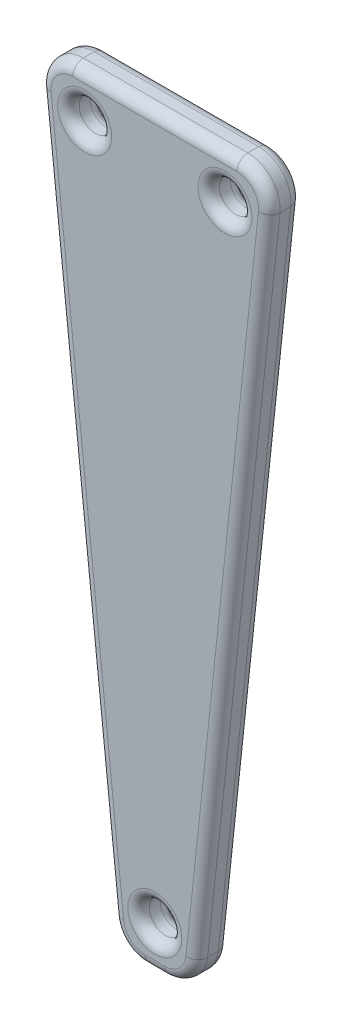
ISO-10303-21;
HEADER;
FILE_DESCRIPTION(('STEP AP214'),'2;1');
FILE_NAME('part.step','',(''),(''),'','','');
FILE_SCHEMA(('AUTOMOTIVE_DESIGN { 1 0 10303 214 1 1 1 1 }'));
ENDSEC;
DATA;
#1=APPLICATION_CONTEXT('core data for automotive mechanical design processes');
#2=APPLICATION_PROTOCOL_DEFINITION('international standard','automotive_design',2000,#1);
#3=PRODUCT_CONTEXT('',#1,'mechanical');
#4=PRODUCT('Part','Part','',(#3));
#5=PRODUCT_RELATED_PRODUCT_CATEGORY('part','',(#4));
#6=PRODUCT_DEFINITION_FORMATION('','',#4);
#7=PRODUCT_DEFINITION_CONTEXT('part definition',#1,'design');
#8=PRODUCT_DEFINITION('design','',#6,#7);
#9=PRODUCT_DEFINITION_SHAPE('','',#8);
#10=(LENGTH_UNIT() NAMED_UNIT(*) SI_UNIT(.MILLI.,.METRE.));
#11=(NAMED_UNIT(*) PLANE_ANGLE_UNIT() SI_UNIT($,.RADIAN.));
#12=(NAMED_UNIT(*) SI_UNIT($,.STERADIAN.) SOLID_ANGLE_UNIT());
#13=UNCERTAINTY_MEASURE_WITH_UNIT(LENGTH_MEASURE(1.E-05),#10,'distance_accuracy_value','');
#14=(GEOMETRIC_REPRESENTATION_CONTEXT(3) GLOBAL_UNCERTAINTY_ASSIGNED_CONTEXT((#13)) GLOBAL_UNIT_ASSIGNED_CONTEXT((#10,
#11,#12)) REPRESENTATION_CONTEXT('',''));
#15=CARTESIAN_POINT('',(0.,0.,0.));
#16=DIRECTION('',(0.,0.,1.));
#17=DIRECTION('',(1.,0.,0.));
#18=AXIS2_PLACEMENT_3D('',#15,#16,#17);
#19=CARTESIAN_POINT('',(5.6007713783845,-62.08,3.));
#20=DIRECTION('',(0.,0.,1.));
#21=DIRECTION('',(1.,0.,0.));
#22=AXIS2_PLACEMENT_3D('',#19,#20,#21);
#23=PLANE('',#22);
#24=DIRECTION('',(0.105820305301029,-0.994385268890281,0.));
#25=VECTOR('',#24,1.);
#26=CARTESIAN_POINT('',(3.61200084060394,-62.291640610602,3.));
#27=LINE('',#26,#25);
#28=CARTESIAN_POINT('',(-3.10083478480537,0.788359389397927,3.));
#29=VERTEX_POINT('',#28);
#30=CARTESIAN_POINT('',(3.61200084060394,-62.291640610602,3.));
#31=VERTEX_POINT('',#30);
#32=EDGE_CURVE('E156',#29,#31,#27,.T.);
#33=ORIENTED_EDGE('',*,*,#32,.T.);
#34=CARTESIAN_POINT('',(5.6007713783845,-62.08,3.));
#35=DIRECTION('',(0.,0.,1.));
#36=DIRECTION('',(1.,0.,0.));
#37=AXIS2_PLACEMENT_3D('',#34,#35,#36);
#38=CIRCLE('',#37,2.);
#39=CARTESIAN_POINT('',(5.60077137838452,-64.08,3.));
#40=VERTEX_POINT('',#39);
#41=EDGE_CURVE('E192',#31,#40,#38,.T.);
#42=ORIENTED_EDGE('',*,*,#41,.T.);
#43=DIRECTION('',(1.,0.,0.));
#44=VECTOR('',#43,1.);
#45=CARTESIAN_POINT('',(7.39922862161549,-64.08,3.));
#46=LINE('',#45,#44);
#47=CARTESIAN_POINT('',(7.39922862161549,-64.08,3.));
#48=VERTEX_POINT('',#47);
#49=EDGE_CURVE('E190',#40,#48,#46,.T.);
#50=ORIENTED_EDGE('',*,*,#49,.T.);
#51=CARTESIAN_POINT('',(7.39922862161551,-62.08,3.));
#52=DIRECTION('',(0.,0.,1.));
#53=DIRECTION('',(1.,0.,0.));
#54=AXIS2_PLACEMENT_3D('',#51,#52,#53);
#55=CIRCLE('',#54,2.);
#56=CARTESIAN_POINT('',(9.38799915939608,-62.291640610602,3.));
#57=VERTEX_POINT('',#56);
#58=EDGE_CURVE('E188',#48,#57,#55,.T.);
#59=ORIENTED_EDGE('',*,*,#58,.T.);
#60=DIRECTION('',(0.105820305301028,0.994385268890281,0.));
#61=VECTOR('',#60,1.);
#62=CARTESIAN_POINT('',(16.1008347848054,0.788359389397919,3.));
#63=LINE('',#62,#61);
#64=CARTESIAN_POINT('',(16.1008347848054,0.788359389397918,3.));
#65=VERTEX_POINT('',#64);
#66=EDGE_CURVE('E186',#57,#65,#63,.T.);
#67=ORIENTED_EDGE('',*,*,#66,.T.);
#68=CARTESIAN_POINT('',(14.1120642470248,1.,3.));
#69=DIRECTION('',(0.,0.,1.));
#70=DIRECTION('',(1.,0.,0.));
#71=AXIS2_PLACEMENT_3D('',#68,#69,#70);
#72=CIRCLE('',#71,2.);
#73=CARTESIAN_POINT('',(14.1120642470248,3.,3.));
#74=VERTEX_POINT('',#73);
#75=EDGE_CURVE('E184',#65,#74,#72,.T.);
#76=ORIENTED_EDGE('',*,*,#75,.T.);
#77=DIRECTION('',(-1.,0.,0.));
#78=VECTOR('',#77,1.);
#79=CARTESIAN_POINT('',(-1.11206424702478,3.,3.));
#80=LINE('',#79,#78);
#81=CARTESIAN_POINT('',(-1.11206424702478,3.,3.));
#82=VERTEX_POINT('',#81);
#83=EDGE_CURVE('E159',#74,#82,#80,.T.);
#84=ORIENTED_EDGE('',*,*,#83,.T.);
#85=CARTESIAN_POINT('',(-1.1120642470248,1.,3.));
#86=DIRECTION('',(0.,0.,1.));
#87=DIRECTION('',(1.,0.,0.));
#88=AXIS2_PLACEMENT_3D('',#85,#86,#87);
#89=CIRCLE('',#88,2.);
#90=EDGE_CURVE('E151',#82,#29,#89,.T.);
#91=ORIENTED_EDGE('',*,*,#90,.T.);
#92=EDGE_LOOP('',(#33,#42,#50,#59,#67,#76,#84,#91));
#93=FACE_BOUND('',#92,.T.);
#94=CARTESIAN_POINT('',(0.,0.,3.));
#95=DIRECTION('',(0.,0.,1.));
#96=DIRECTION('',(1.,0.,0.));
#97=AXIS2_PLACEMENT_3D('',#94,#95,#96);
#98=CIRCLE('',#97,2.5);
#99=CARTESIAN_POINT('',(2.5,0.,3.));
#100=VERTEX_POINT('',#99);
#101=EDGE_CURVE('E176',#100,#100,#98,.F.);
#102=ORIENTED_EDGE('',*,*,#101,.T.);
#103=EDGE_LOOP('',(#102));
#104=FACE_BOUND('',#103,.T.);
#105=CARTESIAN_POINT('',(13.,0.,3.));
#106=DIRECTION('',(0.,0.,1.));
#107=DIRECTION('',(1.,0.,0.));
#108=AXIS2_PLACEMENT_3D('',#105,#106,#107);
#109=CIRCLE('',#108,2.5);
#110=CARTESIAN_POINT('',(15.5,0.,3.));
#111=VERTEX_POINT('',#110);
#112=EDGE_CURVE('E179',#111,#111,#109,.F.);
#113=ORIENTED_EDGE('',*,*,#112,.T.);
#114=EDGE_LOOP('',(#113));
#115=FACE_BOUND('',#114,.T.);
#116=CARTESIAN_POINT('',(6.50000000000001,-61.08,3.));
#117=DIRECTION('',(0.,0.,1.));
#118=DIRECTION('',(1.,0.,0.));
#119=AXIS2_PLACEMENT_3D('',#116,#117,#118);
#120=CIRCLE('',#119,2.5);
#121=CARTESIAN_POINT('',(9.00000000000001,-61.08,3.));
#122=VERTEX_POINT('',#121);
#123=EDGE_CURVE('E354',#122,#122,#120,.F.);
#124=ORIENTED_EDGE('',*,*,#123,.T.);
#125=EDGE_LOOP('',(#124));
#126=FACE_BOUND('',#125,.T.);
#127=ADVANCED_FACE('F35',(#93,#104,#115,#126),#23,.T.);
#128=CARTESIAN_POINT('',(5.6007713783845,-62.08,0.));
#129=DIRECTION('',(0.,0.,1.));
#130=DIRECTION('',(1.,0.,0.));
#131=AXIS2_PLACEMENT_3D('',#128,#129,#130);
#132=PLANE('',#131);
#133=DIRECTION('',(1.,0.,0.));
#134=VECTOR('',#133,1.);
#135=CARTESIAN_POINT('',(5.6007713783845,-64.08,0.));
#136=LINE('',#135,#134);
#137=CARTESIAN_POINT('',(7.39922862161549,-64.08,0.));
#138=VERTEX_POINT('',#137);
#139=CARTESIAN_POINT('',(5.60077137838452,-64.08,0.));
#140=VERTEX_POINT('',#139);
#141=EDGE_CURVE('E221',#138,#140,#136,.F.);
#142=ORIENTED_EDGE('',*,*,#141,.T.);
#143=CARTESIAN_POINT('',(5.6007713783845,-62.08,0.));
#144=DIRECTION('',(0.,0.,1.));
#145=DIRECTION('',(1.,0.,0.));
#146=AXIS2_PLACEMENT_3D('',#143,#144,#145);
#147=CIRCLE('',#146,2.);
#148=CARTESIAN_POINT('',(3.61200084060394,-62.291640610602,0.));
#149=VERTEX_POINT('',#148);
#150=EDGE_CURVE('E223',#140,#149,#147,.F.);
#151=ORIENTED_EDGE('',*,*,#150,.T.);
#152=DIRECTION('',(0.105820305301029,-0.994385268890281,0.));
#153=VECTOR('',#152,1.);
#154=CARTESIAN_POINT('',(3.61200084060394,-62.2916406106021,0.));
#155=LINE('',#154,#153);
#156=CARTESIAN_POINT('',(-3.10083478480537,0.788359389397927,0.));
#157=VERTEX_POINT('',#156);
#158=EDGE_CURVE('E209',#149,#157,#155,.F.);
#159=ORIENTED_EDGE('',*,*,#158,.T.);
#160=CARTESIAN_POINT('',(-1.1120642470248,1.,0.));
#161=DIRECTION('',(0.,0.,1.));
#162=DIRECTION('',(1.,0.,0.));
#163=AXIS2_PLACEMENT_3D('',#160,#161,#162);
#164=CIRCLE('',#163,2.);
#165=CARTESIAN_POINT('',(-1.11206424702478,3.,0.));
#166=VERTEX_POINT('',#165);
#167=EDGE_CURVE('E211',#157,#166,#164,.F.);
#168=ORIENTED_EDGE('',*,*,#167,.T.);
#169=DIRECTION('',(-1.,0.,0.));
#170=VECTOR('',#169,1.);
#171=CARTESIAN_POINT('',(5.6007713783845,3.,0.));
#172=LINE('',#171,#170);
#173=CARTESIAN_POINT('',(14.1120642470248,3.,0.));
#174=VERTEX_POINT('',#173);
#175=EDGE_CURVE('E213',#166,#174,#172,.F.);
#176=ORIENTED_EDGE('',*,*,#175,.T.);
#177=CARTESIAN_POINT('',(14.1120642470248,1.,0.));
#178=DIRECTION('',(0.,0.,1.));
#179=DIRECTION('',(1.,0.,0.));
#180=AXIS2_PLACEMENT_3D('',#177,#178,#179);
#181=CIRCLE('',#180,2.);
#182=CARTESIAN_POINT('',(16.1008347848054,0.788359389397918,0.));
#183=VERTEX_POINT('',#182);
#184=EDGE_CURVE('E215',#174,#183,#181,.F.);
#185=ORIENTED_EDGE('',*,*,#184,.T.);
#186=DIRECTION('',(0.105820305301028,0.994385268890281,0.));
#187=VECTOR('',#186,1.);
#188=CARTESIAN_POINT('',(9.367860148464,-62.4808853471761,0.));
#189=LINE('',#188,#187);
#190=CARTESIAN_POINT('',(9.38799915939608,-62.291640610602,0.));
#191=VERTEX_POINT('',#190);
#192=EDGE_CURVE('E217',#183,#191,#189,.F.);
#193=ORIENTED_EDGE('',*,*,#192,.T.);
#194=CARTESIAN_POINT('',(7.39922862161551,-62.08,0.));
#195=DIRECTION('',(0.,0.,1.));
#196=DIRECTION('',(1.,0.,0.));
#197=AXIS2_PLACEMENT_3D('',#194,#195,#196);
#198=CIRCLE('',#197,2.);
#199=EDGE_CURVE('E219',#191,#138,#198,.F.);
#200=ORIENTED_EDGE('',*,*,#199,.T.);
#201=EDGE_LOOP('',(#142,#151,#159,#168,#176,#185,#193,#200));
#202=FACE_BOUND('',#201,.T.);
#203=CARTESIAN_POINT('',(0.,0.,0.));
#204=DIRECTION('',(0.,0.,1.));
#205=DIRECTION('',(1.,0.,0.));
#206=AXIS2_PLACEMENT_3D('',#203,#204,#205);
#207=CIRCLE('',#206,2.5);
#208=CARTESIAN_POINT('',(2.5,0.,0.));
#209=VERTEX_POINT('',#208);
#210=EDGE_CURVE('E206',#209,#209,#207,.T.);
#211=ORIENTED_EDGE('',*,*,#210,.T.);
#212=EDGE_LOOP('',(#211));
#213=FACE_BOUND('',#212,.T.);
#214=CARTESIAN_POINT('',(13.,0.,0.));
#215=DIRECTION('',(0.,0.,1.));
#216=DIRECTION('',(1.,0.,0.));
#217=AXIS2_PLACEMENT_3D('',#214,#215,#216);
#218=CIRCLE('',#217,2.5);
#219=CARTESIAN_POINT('',(15.5,0.,0.));
#220=VERTEX_POINT('',#219);
#221=EDGE_CURVE('E203',#220,#220,#218,.T.);
#222=ORIENTED_EDGE('',*,*,#221,.T.);
#223=EDGE_LOOP('',(#222));
#224=FACE_BOUND('',#223,.T.);
#225=CARTESIAN_POINT('',(6.50000000000001,-61.08,0.));
#226=DIRECTION('',(0.,0.,1.));
#227=DIRECTION('',(1.,0.,0.));
#228=AXIS2_PLACEMENT_3D('',#225,#226,#227);
#229=CIRCLE('',#228,2.5);
#230=CARTESIAN_POINT('',(9.00000000000001,-61.08,0.));
#231=VERTEX_POINT('',#230);
#232=EDGE_CURVE('E200',#231,#231,#229,.T.);
#233=ORIENTED_EDGE('',*,*,#232,.T.);
#234=EDGE_LOOP('',(#233));
#235=FACE_BOUND('',#234,.T.);
#236=ADVANCED_FACE('F314',(#202,#213,#224,#235),#132,.F.);
#237=CARTESIAN_POINT('',(5.6007713783845,-62.08,3.));
#238=DIRECTION('',(0.,0.,-1.));
#239=DIRECTION('',(-1.,0.,0.));
#240=AXIS2_PLACEMENT_3D('',#237,#238,#239);
#241=CYLINDRICAL_SURFACE('',#240,3.);
#242=DIRECTION('',(0.,0.,-1.));
#243=VECTOR('',#242,1.);
#244=CARTESIAN_POINT('',(5.60077137838452,-65.08,3.));
#245=LINE('',#244,#243);
#246=CARTESIAN_POINT('',(5.60077137838452,-65.08,2.));
#247=VERTEX_POINT('',#246);
#248=CARTESIAN_POINT('',(5.60077137838452,-65.08,1.));
#249=VERTEX_POINT('',#248);
#250=EDGE_CURVE('E352',#247,#249,#245,.T.);
#251=ORIENTED_EDGE('',*,*,#250,.F.);
#252=CARTESIAN_POINT('',(5.6007713783845,-62.08,2.));
#253=DIRECTION('',(0.,0.,1.));
#254=DIRECTION('',(1.,0.,0.));
#255=AXIS2_PLACEMENT_3D('',#252,#253,#254);
#256=CIRCLE('',#255,3.);
#257=CARTESIAN_POINT('',(2.61761557171366,-62.3974609159031,2.));
#258=VERTEX_POINT('',#257);
#259=EDGE_CURVE('E197',#247,#258,#256,.F.);
#260=ORIENTED_EDGE('',*,*,#259,.T.);
#261=DIRECTION('',(0.,0.,-1.));
#262=VECTOR('',#261,1.);
#263=CARTESIAN_POINT('',(2.61761557171366,-62.3974609159031,3.));
#264=LINE('',#263,#262);
#265=CARTESIAN_POINT('',(2.61761557171366,-62.3974609159031,1.));
#266=VERTEX_POINT('',#265);
#267=EDGE_CURVE('E280',#258,#266,#264,.T.);
#268=ORIENTED_EDGE('',*,*,#267,.T.);
#269=CARTESIAN_POINT('',(5.6007713783845,-62.08,1.));
#270=DIRECTION('',(0.,0.,1.));
#271=DIRECTION('',(1.,0.,0.));
#272=AXIS2_PLACEMENT_3D('',#269,#270,#271);
#273=CIRCLE('',#272,3.);
#274=EDGE_CURVE('E194',#266,#249,#273,.T.);
#275=ORIENTED_EDGE('',*,*,#274,.T.);
#276=EDGE_LOOP('',(#251,#260,#268,#275));
#277=FACE_BOUND('',#276,.T.);
#278=ADVANCED_FACE('F332',(#277),#241,.T.);
#279=CARTESIAN_POINT('',(5.60077137838452,-65.08,3.));
#280=DIRECTION('',(0.,1.,0.));
#281=DIRECTION('',(0.,0.,1.));
#282=AXIS2_PLACEMENT_3D('',#279,#280,#281);
#283=PLANE('',#282);
#284=DIRECTION('',(0.,0.,-1.));
#285=VECTOR('',#284,1.);
#286=CARTESIAN_POINT('',(7.39922862161549,-65.08,3.));
#287=LINE('',#286,#285);
#288=CARTESIAN_POINT('',(7.39922862161549,-65.08,2.));
#289=VERTEX_POINT('',#288);
#290=CARTESIAN_POINT('',(7.39922862161549,-65.08,1.));
#291=VERTEX_POINT('',#290);
#292=EDGE_CURVE('E349',#289,#291,#287,.T.);
#293=ORIENTED_EDGE('',*,*,#292,.F.);
#294=DIRECTION('',(1.,0.,0.));
#295=VECTOR('',#294,1.);
#296=CARTESIAN_POINT('',(5.60077137838452,-65.08,2.));
#297=LINE('',#296,#295);
#298=EDGE_CURVE('E228',#289,#247,#297,.F.);
#299=ORIENTED_EDGE('',*,*,#298,.T.);
#300=ORIENTED_EDGE('',*,*,#250,.T.);
#301=DIRECTION('',(1.,0.,0.));
#302=VECTOR('',#301,1.);
#303=CARTESIAN_POINT('',(5.60077137838452,-65.08,1.));
#304=LINE('',#303,#302);
#305=EDGE_CURVE('E226',#249,#291,#304,.T.);
#306=ORIENTED_EDGE('',*,*,#305,.T.);
#307=EDGE_LOOP('',(#293,#299,#300,#306));
#308=FACE_BOUND('',#307,.T.);
#309=ADVANCED_FACE('F411',(#308),#283,.F.);
#310=CARTESIAN_POINT('',(7.39922862161551,-62.08,3.));
#311=DIRECTION('',(0.,0.,-1.));
#312=DIRECTION('',(-1.,0.,0.));
#313=AXIS2_PLACEMENT_3D('',#310,#311,#312);
#314=CYLINDRICAL_SURFACE('',#313,3.);
#315=DIRECTION('',(0.,0.,-1.));
#316=VECTOR('',#315,1.);
#317=CARTESIAN_POINT('',(10.3823844282864,-62.3974609159031,3.));
#318=LINE('',#317,#316);
#319=CARTESIAN_POINT('',(10.3823844282864,-62.3974609159031,2.));
#320=VERTEX_POINT('',#319);
#321=CARTESIAN_POINT('',(10.3823844282864,-62.3974609159031,1.));
#322=VERTEX_POINT('',#321);
#323=EDGE_CURVE('E346',#320,#322,#318,.T.);
#324=ORIENTED_EDGE('',*,*,#323,.F.);
#325=CARTESIAN_POINT('',(7.39922862161551,-62.08,2.));
#326=DIRECTION('',(0.,0.,1.));
#327=DIRECTION('',(1.,0.,0.));
#328=AXIS2_PLACEMENT_3D('',#325,#326,#327);
#329=CIRCLE('',#328,3.);
#330=EDGE_CURVE('E232',#320,#289,#329,.F.);
#331=ORIENTED_EDGE('',*,*,#330,.T.);
#332=ORIENTED_EDGE('',*,*,#292,.T.);
#333=CARTESIAN_POINT('',(7.39922862161551,-62.08,1.));
#334=DIRECTION('',(0.,0.,1.));
#335=DIRECTION('',(1.,0.,0.));
#336=AXIS2_PLACEMENT_3D('',#333,#334,#335);
#337=CIRCLE('',#336,3.);
#338=EDGE_CURVE('E230',#291,#322,#337,.T.);
#339=ORIENTED_EDGE('',*,*,#338,.T.);
#340=EDGE_LOOP('',(#324,#331,#332,#339));
#341=FACE_BOUND('',#340,.T.);
#342=ADVANCED_FACE('F407',(#341),#314,.T.);
#343=CARTESIAN_POINT('',(10.3823844282864,-62.3974609159031,3.));
#344=DIRECTION('',(-0.994385268890281,0.105820305301028,0.));
#345=DIRECTION('',(-0.105820305301028,-0.994385268890281,0.));
#346=AXIS2_PLACEMENT_3D('',#343,#344,#345);
#347=PLANE('',#346);
#348=DIRECTION('',(0.,0.,-1.));
#349=VECTOR('',#348,1.);
#350=CARTESIAN_POINT('',(17.0952200536956,0.682539084096889,3.));
#351=LINE('',#350,#349);
#352=CARTESIAN_POINT('',(17.0952200536956,0.682539084096889,2.));
#353=VERTEX_POINT('',#352);
#354=CARTESIAN_POINT('',(17.0952200536956,0.682539084096889,1.));
#355=VERTEX_POINT('',#354);
#356=EDGE_CURVE('E343',#353,#355,#351,.T.);
#357=ORIENTED_EDGE('',*,*,#356,.F.);
#358=DIRECTION('',(0.105820305301028,0.994385268890281,0.));
#359=VECTOR('',#358,1.);
#360=CARTESIAN_POINT('',(10.3823844282864,-62.3974609159031,2.));
#361=LINE('',#360,#359);
#362=EDGE_CURVE('E236',#353,#320,#361,.F.);
#363=ORIENTED_EDGE('',*,*,#362,.T.);
#364=ORIENTED_EDGE('',*,*,#323,.T.);
#365=DIRECTION('',(0.105820305301028,0.994385268890281,0.));
#366=VECTOR('',#365,1.);
#367=CARTESIAN_POINT('',(10.3823844282864,-62.3974609159031,1.));
#368=LINE('',#367,#366);
#369=EDGE_CURVE('E234',#322,#355,#368,.T.);
#370=ORIENTED_EDGE('',*,*,#369,.T.);
#371=EDGE_LOOP('',(#357,#363,#364,#370));
#372=FACE_BOUND('',#371,.T.);
#373=ADVANCED_FACE('F403',(#372),#347,.F.);
#374=CARTESIAN_POINT('',(14.1120642470248,1.,3.));
#375=DIRECTION('',(0.,0.,-1.));
#376=DIRECTION('',(-1.,0.,0.));
#377=AXIS2_PLACEMENT_3D('',#374,#375,#376);
#378=CYLINDRICAL_SURFACE('',#377,3.);
#379=DIRECTION('',(0.,0.,-1.));
#380=VECTOR('',#379,1.);
#381=CARTESIAN_POINT('',(14.1120642470248,4.,3.));
#382=LINE('',#381,#380);
#383=CARTESIAN_POINT('',(14.1120642470248,4.,2.));
#384=VERTEX_POINT('',#383);
#385=CARTESIAN_POINT('',(14.1120642470248,4.,1.));
#386=VERTEX_POINT('',#385);
#387=EDGE_CURVE('E340',#384,#386,#382,.T.);
#388=ORIENTED_EDGE('',*,*,#387,.F.);
#389=CARTESIAN_POINT('',(14.1120642470248,1.,2.));
#390=DIRECTION('',(0.,0.,1.));
#391=DIRECTION('',(1.,0.,0.));
#392=AXIS2_PLACEMENT_3D('',#389,#390,#391);
#393=CIRCLE('',#392,3.);
#394=EDGE_CURVE('E240',#384,#353,#393,.F.);
#395=ORIENTED_EDGE('',*,*,#394,.T.);
#396=ORIENTED_EDGE('',*,*,#356,.T.);
#397=CARTESIAN_POINT('',(14.1120642470248,1.,1.));
#398=DIRECTION('',(0.,0.,1.));
#399=DIRECTION('',(1.,0.,0.));
#400=AXIS2_PLACEMENT_3D('',#397,#398,#399);
#401=CIRCLE('',#400,3.);
#402=EDGE_CURVE('E238',#355,#386,#401,.T.);
#403=ORIENTED_EDGE('',*,*,#402,.T.);
#404=EDGE_LOOP('',(#388,#395,#396,#403));
#405=FACE_BOUND('',#404,.T.);
#406=ADVANCED_FACE('F399',(#405),#378,.T.);
#407=CARTESIAN_POINT('',(-1.11206424702478,4.,3.));
#408=DIRECTION('',(0.,-1.,0.));
#409=DIRECTION('',(0.,0.,-1.));
#410=AXIS2_PLACEMENT_3D('',#407,#408,#409);
#411=PLANE('',#410);
#412=DIRECTION('',(0.,0.,-1.));
#413=VECTOR('',#412,1.);
#414=CARTESIAN_POINT('',(-1.11206424702478,4.,3.));
#415=LINE('',#414,#413);
#416=CARTESIAN_POINT('',(-1.11206424702478,4.,2.));
#417=VERTEX_POINT('',#416);
#418=CARTESIAN_POINT('',(-1.11206424702478,4.,1.));
#419=VERTEX_POINT('',#418);
#420=EDGE_CURVE('E336',#417,#419,#415,.T.);
#421=ORIENTED_EDGE('',*,*,#420,.F.);
#422=DIRECTION('',(-1.,0.,0.));
#423=VECTOR('',#422,1.);
#424=CARTESIAN_POINT('',(14.1120642470248,4.,2.));
#425=LINE('',#424,#423);
#426=EDGE_CURVE('E244',#417,#384,#425,.F.);
#427=ORIENTED_EDGE('',*,*,#426,.T.);
#428=ORIENTED_EDGE('',*,*,#387,.T.);
#429=DIRECTION('',(-1.,0.,0.));
#430=VECTOR('',#429,1.);
#431=CARTESIAN_POINT('',(-1.11206424702478,4.,1.));
#432=LINE('',#431,#430);
#433=EDGE_CURVE('E242',#386,#419,#432,.T.);
#434=ORIENTED_EDGE('',*,*,#433,.T.);
#435=EDGE_LOOP('',(#421,#427,#428,#434));
#436=FACE_BOUND('',#435,.T.);
#437=ADVANCED_FACE('F396',(#436),#411,.F.);
#438=CARTESIAN_POINT('',(-1.1120642470248,1.,3.));
#439=DIRECTION('',(0.,0.,-1.));
#440=DIRECTION('',(-1.,0.,0.));
#441=AXIS2_PLACEMENT_3D('',#438,#439,#440);
#442=CYLINDRICAL_SURFACE('',#441,3.);
#443=DIRECTION('',(0.,0.,-1.));
#444=VECTOR('',#443,1.);
#445=CARTESIAN_POINT('',(-4.09522005369565,0.682539084096891,3.));
#446=LINE('',#445,#444);
#447=CARTESIAN_POINT('',(-4.09522005369565,0.682539084096891,2.));
#448=VERTEX_POINT('',#447);
#449=CARTESIAN_POINT('',(-4.09522005369565,0.682539084096891,1.));
#450=VERTEX_POINT('',#449);
#451=EDGE_CURVE('E329',#448,#450,#446,.T.);
#452=ORIENTED_EDGE('',*,*,#451,.F.);
#453=CARTESIAN_POINT('',(-1.1120642470248,1.,2.));
#454=DIRECTION('',(0.,0.,1.));
#455=DIRECTION('',(1.,0.,0.));
#456=AXIS2_PLACEMENT_3D('',#453,#454,#455);
#457=CIRCLE('',#456,3.);
#458=EDGE_CURVE('E168',#448,#417,#457,.F.);
#459=ORIENTED_EDGE('',*,*,#458,.T.);
#460=ORIENTED_EDGE('',*,*,#420,.T.);
#461=CARTESIAN_POINT('',(-1.1120642470248,1.,1.));
#462=DIRECTION('',(0.,0.,1.));
#463=DIRECTION('',(1.,0.,0.));
#464=AXIS2_PLACEMENT_3D('',#461,#462,#463);
#465=CIRCLE('',#464,3.);
#466=EDGE_CURVE('E52',#419,#450,#465,.T.);
#467=ORIENTED_EDGE('',*,*,#466,.T.);
#468=EDGE_LOOP('',(#452,#459,#460,#467));
#469=FACE_BOUND('',#468,.T.);
#470=ADVANCED_FACE('F393',(#469),#442,.T.);
#471=CARTESIAN_POINT('',(-4.09522005369565,0.682539084096891,3.));
#472=DIRECTION('',(0.994385268890281,0.105820305301029,0.));
#473=DIRECTION('',(-0.105820305301029,0.994385268890281,0.));
#474=AXIS2_PLACEMENT_3D('',#471,#472,#473);
#475=PLANE('',#474);
#476=ORIENTED_EDGE('',*,*,#267,.F.);
#477=DIRECTION('',(0.105820305301029,-0.994385268890281,0.));
#478=VECTOR('',#477,1.);
#479=CARTESIAN_POINT('',(-4.09522005369565,0.682539084096897,2.));
#480=LINE('',#479,#478);
#481=EDGE_CURVE('E59',#258,#448,#480,.F.);
#482=ORIENTED_EDGE('',*,*,#481,.T.);
#483=ORIENTED_EDGE('',*,*,#451,.T.);
#484=DIRECTION('',(0.105820305301029,-0.994385268890281,0.));
#485=VECTOR('',#484,1.);
#486=CARTESIAN_POINT('',(-4.09522005369565,0.682539084096891,1.));
#487=LINE('',#486,#485);
#488=EDGE_CURVE('E248',#450,#266,#487,.T.);
#489=ORIENTED_EDGE('',*,*,#488,.T.);
#490=EDGE_LOOP('',(#476,#482,#483,#489));
#491=FACE_BOUND('',#490,.T.);
#492=ADVANCED_FACE('F328',(#491),#475,.F.);
#493=CARTESIAN_POINT('',(0.,0.,3.));
#494=DIRECTION('',(0.,0.,-1.));
#495=DIRECTION('',(-1.,0.,0.));
#496=AXIS2_PLACEMENT_3D('',#493,#494,#495);
#497=CYLINDRICAL_SURFACE('',#496,1.5);
#498=CARTESIAN_POINT('',(0.,0.,1.));
#499=DIRECTION('',(0.,0.,1.));
#500=DIRECTION('',(1.,0.,0.));
#501=AXIS2_PLACEMENT_3D('',#498,#499,#500);
#502=CIRCLE('',#501,1.5);
#503=CARTESIAN_POINT('',(1.5,0.,1.));
#504=VERTEX_POINT('',#503);
#505=EDGE_CURVE('E254',#504,#504,#502,.F.);
#506=ORIENTED_EDGE('',*,*,#505,.T.);
#507=EDGE_LOOP('',(#506));
#508=FACE_BOUND('',#507,.T.);
#509=CARTESIAN_POINT('',(0.,0.,2.));
#510=DIRECTION('',(0.,0.,1.));
#511=DIRECTION('',(1.,0.,0.));
#512=AXIS2_PLACEMENT_3D('',#509,#510,#511);
#513=CIRCLE('',#512,1.5);
#514=CARTESIAN_POINT('',(1.5,0.,2.));
#515=VERTEX_POINT('',#514);
#516=EDGE_CURVE('E251',#515,#515,#513,.T.);
#517=ORIENTED_EDGE('',*,*,#516,.T.);
#518=EDGE_LOOP('',(#517));
#519=FACE_BOUND('',#518,.T.);
#520=ADVANCED_FACE('F372',(#508,#519),#497,.F.);
#521=CARTESIAN_POINT('',(13.,0.,3.));
#522=DIRECTION('',(0.,0.,-1.));
#523=DIRECTION('',(-1.,0.,0.));
#524=AXIS2_PLACEMENT_3D('',#521,#522,#523);
#525=CYLINDRICAL_SURFACE('',#524,1.5);
#526=CARTESIAN_POINT('',(13.,0.,1.));
#527=DIRECTION('',(0.,0.,1.));
#528=DIRECTION('',(1.,0.,0.));
#529=AXIS2_PLACEMENT_3D('',#526,#527,#528);
#530=CIRCLE('',#529,1.5);
#531=CARTESIAN_POINT('',(14.5,0.,1.));
#532=VERTEX_POINT('',#531);
#533=EDGE_CURVE('E260',#532,#532,#530,.F.);
#534=ORIENTED_EDGE('',*,*,#533,.T.);
#535=EDGE_LOOP('',(#534));
#536=FACE_BOUND('',#535,.T.);
#537=CARTESIAN_POINT('',(13.,0.,2.));
#538=DIRECTION('',(0.,0.,1.));
#539=DIRECTION('',(1.,0.,0.));
#540=AXIS2_PLACEMENT_3D('',#537,#538,#539);
#541=CIRCLE('',#540,1.5);
#542=CARTESIAN_POINT('',(14.5,0.,2.));
#543=VERTEX_POINT('',#542);
#544=EDGE_CURVE('E257',#543,#543,#541,.T.);
#545=ORIENTED_EDGE('',*,*,#544,.T.);
#546=EDGE_LOOP('',(#545));
#547=FACE_BOUND('',#546,.T.);
#548=ADVANCED_FACE('F369',(#536,#547),#525,.F.);
#549=CARTESIAN_POINT('',(6.50000000000001,-61.08,3.));
#550=DIRECTION('',(0.,0.,-1.));
#551=DIRECTION('',(-1.,0.,0.));
#552=AXIS2_PLACEMENT_3D('',#549,#550,#551);
#553=CYLINDRICAL_SURFACE('',#552,1.5);
#554=CARTESIAN_POINT('',(6.50000000000001,-61.08,1.));
#555=DIRECTION('',(0.,0.,1.));
#556=DIRECTION('',(1.,0.,0.));
#557=AXIS2_PLACEMENT_3D('',#554,#555,#556);
#558=CIRCLE('',#557,1.5);
#559=CARTESIAN_POINT('',(8.00000000000001,-61.08,1.));
#560=VERTEX_POINT('',#559);
#561=EDGE_CURVE('E11',#560,#560,#558,.F.);
#562=ORIENTED_EDGE('',*,*,#561,.T.);
#563=EDGE_LOOP('',(#562));
#564=FACE_BOUND('',#563,.T.);
#565=CARTESIAN_POINT('',(6.50000000000001,-61.08,2.));
#566=DIRECTION('',(0.,0.,1.));
#567=DIRECTION('',(1.,0.,0.));
#568=AXIS2_PLACEMENT_3D('',#565,#566,#567);
#569=CIRCLE('',#568,1.5);
#570=CARTESIAN_POINT('',(8.00000000000001,-61.08,2.));
#571=VERTEX_POINT('',#570);
#572=EDGE_CURVE('E44',#571,#571,#569,.T.);
#573=ORIENTED_EDGE('',*,*,#572,.T.);
#574=EDGE_LOOP('',(#573));
#575=FACE_BOUND('',#574,.T.);
#576=ADVANCED_FACE('F371',(#564,#575),#553,.F.);
#577=CARTESIAN_POINT('',(14.1120642470248,1.,2.));
#578=DIRECTION('',(0.,0.,1.));
#579=DIRECTION('',(1.,0.,0.));
#580=AXIS2_PLACEMENT_3D('',#577,#578,#579);
#581=TOROIDAL_SURFACE('',#580,2.,1.);
#582=CARTESIAN_POINT('',(16.1008347848054,0.788359389397926,2.));
#583=DIRECTION('',(-0.105820305301037,-0.994385268890281,0.));
#584=DIRECTION('',(0.994385268890281,-0.105820305301037,0.));
#585=AXIS2_PLACEMENT_3D('',#582,#583,#584);
#586=CIRCLE('',#585,1.);
#587=EDGE_CURVE('E274',#353,#65,#586,.T.);
#588=ORIENTED_EDGE('',*,*,#587,.F.);
#589=ORIENTED_EDGE('',*,*,#394,.F.);
#590=CARTESIAN_POINT('',(14.1120642470248,3.,2.));
#591=DIRECTION('',(-1.,0.,0.));
#592=DIRECTION('',(0.,-1.,0.));
#593=AXIS2_PLACEMENT_3D('',#590,#591,#592);
#594=CIRCLE('',#593,1.);
#595=EDGE_CURVE('E277',#74,#384,#594,.T.);
#596=ORIENTED_EDGE('',*,*,#595,.F.);
#597=ORIENTED_EDGE('',*,*,#75,.F.);
#598=EDGE_LOOP('',(#588,#589,#596,#597));
#599=FACE_BOUND('',#598,.T.);
#600=ADVANCED_FACE('F379',(#599),#581,.T.);
#601=CARTESIAN_POINT('',(5.6007713783845,3.,2.));
#602=DIRECTION('',(1.,0.,0.));
#603=DIRECTION('',(0.,0.,-1.));
#604=AXIS2_PLACEMENT_3D('',#601,#602,#603);
#605=CYLINDRICAL_SURFACE('',#604,1.);
#606=ORIENTED_EDGE('',*,*,#595,.T.);
#607=ORIENTED_EDGE('',*,*,#426,.F.);
#608=CARTESIAN_POINT('',(-1.11206424702478,3.,2.));
#609=DIRECTION('',(-1.,0.,0.));
#610=DIRECTION('',(0.,0.,1.));
#611=AXIS2_PLACEMENT_3D('',#608,#609,#610);
#612=CIRCLE('',#611,1.);
#613=EDGE_CURVE('E272',#82,#417,#612,.T.);
#614=ORIENTED_EDGE('',*,*,#613,.F.);
#615=ORIENTED_EDGE('',*,*,#83,.F.);
#616=EDGE_LOOP('',(#606,#607,#614,#615));
#617=FACE_BOUND('',#616,.T.);
#618=ADVANCED_FACE('F437',(#617),#605,.T.);
#619=CARTESIAN_POINT('',(9.367860148464,-62.4808853471761,2.));
#620=DIRECTION('',(-0.105820305301028,-0.994385268890281,0.));
#621=DIRECTION('',(0.994385268890281,-0.105820305301028,0.));
#622=AXIS2_PLACEMENT_3D('',#619,#620,#621);
#623=CYLINDRICAL_SURFACE('',#622,1.);
#624=ORIENTED_EDGE('',*,*,#587,.T.);
#625=ORIENTED_EDGE('',*,*,#66,.F.);
#626=CARTESIAN_POINT('',(9.38799915939608,-62.291640610602,2.));
#627=DIRECTION('',(-0.105820305301027,-0.994385268890282,0.));
#628=DIRECTION('',(0.994385268890282,-0.105820305301027,0.));
#629=AXIS2_PLACEMENT_3D('',#626,#627,#628);
#630=CIRCLE('',#629,1.);
#631=EDGE_CURVE('E170',#320,#57,#630,.T.);
#632=ORIENTED_EDGE('',*,*,#631,.F.);
#633=ORIENTED_EDGE('',*,*,#362,.F.);
#634=EDGE_LOOP('',(#624,#625,#632,#633));
#635=FACE_BOUND('',#634,.T.);
#636=ADVANCED_FACE('F434',(#635),#623,.T.);
#637=CARTESIAN_POINT('',(-1.1120642470248,1.,2.));
#638=DIRECTION('',(0.,0.,1.));
#639=DIRECTION('',(1.,0.,0.));
#640=AXIS2_PLACEMENT_3D('',#637,#638,#639);
#641=TOROIDAL_SURFACE('',#640,2.,1.);
#642=ORIENTED_EDGE('',*,*,#613,.T.);
#643=ORIENTED_EDGE('',*,*,#458,.F.);
#644=CARTESIAN_POINT('',(-3.10083478480537,0.788359389397927,2.));
#645=DIRECTION('',(0.105820305301036,-0.994385268890281,0.));
#646=DIRECTION('',(0.994385268890281,0.105820305301036,0.));
#647=AXIS2_PLACEMENT_3D('',#644,#645,#646);
#648=CIRCLE('',#647,1.);
#649=EDGE_CURVE('E166',#29,#448,#648,.T.);
#650=ORIENTED_EDGE('',*,*,#649,.F.);
#651=ORIENTED_EDGE('',*,*,#90,.F.);
#652=EDGE_LOOP('',(#642,#643,#650,#651));
#653=FACE_BOUND('',#652,.T.);
#654=ADVANCED_FACE('F167',(#653),#641,.T.);
#655=CARTESIAN_POINT('',(7.39922862161551,-62.08,2.));
#656=DIRECTION('',(0.,0.,1.));
#657=DIRECTION('',(1.,0.,0.));
#658=AXIS2_PLACEMENT_3D('',#655,#656,#657);
#659=TOROIDAL_SURFACE('',#658,2.,1.);
#660=ORIENTED_EDGE('',*,*,#631,.T.);
#661=ORIENTED_EDGE('',*,*,#58,.F.);
#662=CARTESIAN_POINT('',(7.3992286216155,-64.08,2.));
#663=DIRECTION('',(-1.,0.,0.));
#664=DIRECTION('',(0.,0.,1.));
#665=AXIS2_PLACEMENT_3D('',#662,#663,#664);
#666=CIRCLE('',#665,1.);
#667=EDGE_CURVE('E171',#289,#48,#666,.T.);
#668=ORIENTED_EDGE('',*,*,#667,.F.);
#669=ORIENTED_EDGE('',*,*,#330,.F.);
#670=EDGE_LOOP('',(#660,#661,#668,#669));
#671=FACE_BOUND('',#670,.T.);
#672=ADVANCED_FACE('F428',(#671),#659,.T.);
#673=CARTESIAN_POINT('',(3.61200084060394,-62.2916406106021,2.));
#674=DIRECTION('',(-0.105820305301029,0.994385268890281,0.));
#675=DIRECTION('',(-0.994385268890281,-0.105820305301029,0.));
#676=AXIS2_PLACEMENT_3D('',#673,#674,#675);
#677=CYLINDRICAL_SURFACE('',#676,1.);
#678=ORIENTED_EDGE('',*,*,#649,.T.);
#679=ORIENTED_EDGE('',*,*,#481,.F.);
#680=CARTESIAN_POINT('',(3.61200084060394,-62.291640610602,2.));
#681=DIRECTION('',(0.10582030530102,-0.994385268890282,0.));
#682=DIRECTION('',(0.994385268890282,0.10582030530102,0.));
#683=AXIS2_PLACEMENT_3D('',#680,#681,#682);
#684=CIRCLE('',#683,1.);
#685=EDGE_CURVE('E174',#31,#258,#684,.T.);
#686=ORIENTED_EDGE('',*,*,#685,.F.);
#687=ORIENTED_EDGE('',*,*,#32,.F.);
#688=EDGE_LOOP('',(#678,#679,#686,#687));
#689=FACE_BOUND('',#688,.T.);
#690=ADVANCED_FACE('F173',(#689),#677,.T.);
#691=CARTESIAN_POINT('',(5.6007713783845,-64.08,2.));
#692=DIRECTION('',(-1.,0.,0.));
#693=DIRECTION('',(0.,0.,1.));
#694=AXIS2_PLACEMENT_3D('',#691,#692,#693);
#695=CYLINDRICAL_SURFACE('',#694,1.);
#696=ORIENTED_EDGE('',*,*,#667,.T.);
#697=ORIENTED_EDGE('',*,*,#49,.F.);
#698=CARTESIAN_POINT('',(5.60077137838452,-64.08,2.));
#699=DIRECTION('',(-1.,0.,0.));
#700=DIRECTION('',(0.,0.,1.));
#701=AXIS2_PLACEMENT_3D('',#698,#699,#700);
#702=CIRCLE('',#701,1.);
#703=EDGE_CURVE('E265',#247,#40,#702,.T.);
#704=ORIENTED_EDGE('',*,*,#703,.F.);
#705=ORIENTED_EDGE('',*,*,#298,.F.);
#706=EDGE_LOOP('',(#696,#697,#704,#705));
#707=FACE_BOUND('',#706,.T.);
#708=ADVANCED_FACE('F421',(#707),#695,.T.);
#709=CARTESIAN_POINT('',(5.6007713783845,-62.08,2.));
#710=DIRECTION('',(0.,0.,1.));
#711=DIRECTION('',(1.,0.,0.));
#712=AXIS2_PLACEMENT_3D('',#709,#710,#711);
#713=TOROIDAL_SURFACE('',#712,2.,1.);
#714=ORIENTED_EDGE('',*,*,#685,.T.);
#715=ORIENTED_EDGE('',*,*,#259,.F.);
#716=ORIENTED_EDGE('',*,*,#703,.T.);
#717=ORIENTED_EDGE('',*,*,#41,.F.);
#718=EDGE_LOOP('',(#714,#715,#716,#717));
#719=FACE_BOUND('',#718,.T.);
#720=ADVANCED_FACE('F418',(#719),#713,.T.);
#721=CARTESIAN_POINT('',(14.1120642470248,1.,1.));
#722=DIRECTION('',(0.,0.,1.));
#723=DIRECTION('',(1.,0.,0.));
#724=AXIS2_PLACEMENT_3D('',#721,#722,#723);
#725=TOROIDAL_SURFACE('',#724,2.,1.);
#726=CARTESIAN_POINT('',(16.1008347848054,0.788359389397918,1.));
#727=DIRECTION('',(-0.105820305301028,-0.994385268890281,0.));
#728=DIRECTION('',(0.994385268890281,-0.105820305301028,0.));
#729=AXIS2_PLACEMENT_3D('',#726,#727,#728);
#730=CIRCLE('',#729,1.);
#731=EDGE_CURVE('E296',#183,#355,#730,.T.);
#732=ORIENTED_EDGE('',*,*,#731,.F.);
#733=ORIENTED_EDGE('',*,*,#184,.F.);
#734=CARTESIAN_POINT('',(14.1120642470248,3.,1.));
#735=DIRECTION('',(-1.,0.,0.));
#736=DIRECTION('',(0.,-1.,0.));
#737=AXIS2_PLACEMENT_3D('',#734,#735,#736);
#738=CIRCLE('',#737,1.);
#739=EDGE_CURVE('E39',#386,#174,#738,.T.);
#740=ORIENTED_EDGE('',*,*,#739,.F.);
#741=ORIENTED_EDGE('',*,*,#402,.F.);
#742=EDGE_LOOP('',(#732,#733,#740,#741));
#743=FACE_BOUND('',#742,.T.);
#744=ADVANCED_FACE('F312',(#743),#725,.T.);
#745=CARTESIAN_POINT('',(-1.11206424702478,3.,1.));
#746=DIRECTION('',(-1.,0.,0.));
#747=DIRECTION('',(0.,0.,1.));
#748=AXIS2_PLACEMENT_3D('',#745,#746,#747);
#749=CYLINDRICAL_SURFACE('',#748,1.);
#750=ORIENTED_EDGE('',*,*,#739,.T.);
#751=ORIENTED_EDGE('',*,*,#175,.F.);
#752=CARTESIAN_POINT('',(-1.11206424702478,3.,1.));
#753=DIRECTION('',(-1.,0.,0.));
#754=DIRECTION('',(0.,0.,1.));
#755=AXIS2_PLACEMENT_3D('',#752,#753,#754);
#756=CIRCLE('',#755,1.);
#757=EDGE_CURVE('E294',#419,#166,#756,.T.);
#758=ORIENTED_EDGE('',*,*,#757,.F.);
#759=ORIENTED_EDGE('',*,*,#433,.F.);
#760=EDGE_LOOP('',(#750,#751,#758,#759));
#761=FACE_BOUND('',#760,.T.);
#762=ADVANCED_FACE('F307',(#761),#749,.T.);
#763=CARTESIAN_POINT('',(9.38799915939608,-62.291640610602,1.));
#764=DIRECTION('',(0.105820305301028,0.994385268890281,0.));
#765=DIRECTION('',(-0.994385268890281,0.105820305301028,0.));
#766=AXIS2_PLACEMENT_3D('',#763,#764,#765);
#767=CYLINDRICAL_SURFACE('',#766,1.);
#768=ORIENTED_EDGE('',*,*,#731,.T.);
#769=ORIENTED_EDGE('',*,*,#369,.F.);
#770=CARTESIAN_POINT('',(9.38799915939608,-62.291640610602,1.));
#771=DIRECTION('',(-0.10582030530102,-0.994385268890282,0.));
#772=DIRECTION('',(0.994385268890282,-0.10582030530102,0.));
#773=AXIS2_PLACEMENT_3D('',#770,#771,#772);
#774=CIRCLE('',#773,1.);
#775=EDGE_CURVE('E291',#191,#322,#774,.T.);
#776=ORIENTED_EDGE('',*,*,#775,.F.);
#777=ORIENTED_EDGE('',*,*,#192,.F.);
#778=EDGE_LOOP('',(#768,#769,#776,#777));
#779=FACE_BOUND('',#778,.T.);
#780=ADVANCED_FACE('F462',(#779),#767,.T.);
#781=CARTESIAN_POINT('',(-1.1120642470248,1.,1.));
#782=DIRECTION('',(0.,0.,1.));
#783=DIRECTION('',(1.,0.,0.));
#784=AXIS2_PLACEMENT_3D('',#781,#782,#783);
#785=TOROIDAL_SURFACE('',#784,2.,1.);
#786=ORIENTED_EDGE('',*,*,#757,.T.);
#787=ORIENTED_EDGE('',*,*,#167,.F.);
#788=CARTESIAN_POINT('',(-3.10083478480537,0.788359389397927,1.));
#789=DIRECTION('',(0.105820305301036,-0.994385268890281,0.));
#790=DIRECTION('',(0.994385268890281,0.105820305301036,0.));
#791=AXIS2_PLACEMENT_3D('',#788,#789,#790);
#792=CIRCLE('',#791,1.);
#793=EDGE_CURVE('E288',#450,#157,#792,.T.);
#794=ORIENTED_EDGE('',*,*,#793,.F.);
#795=ORIENTED_EDGE('',*,*,#466,.F.);
#796=EDGE_LOOP('',(#786,#787,#794,#795));
#797=FACE_BOUND('',#796,.T.);
#798=ADVANCED_FACE('F321',(#797),#785,.T.);
#799=CARTESIAN_POINT('',(7.39922862161551,-62.08,1.));
#800=DIRECTION('',(0.,0.,1.));
#801=DIRECTION('',(1.,0.,0.));
#802=AXIS2_PLACEMENT_3D('',#799,#800,#801);
#803=TOROIDAL_SURFACE('',#802,2.,1.);
#804=ORIENTED_EDGE('',*,*,#775,.T.);
#805=ORIENTED_EDGE('',*,*,#338,.F.);
#806=CARTESIAN_POINT('',(7.39922862161549,-64.08,1.));
#807=DIRECTION('',(-1.,0.,0.));
#808=DIRECTION('',(0.,0.,1.));
#809=AXIS2_PLACEMENT_3D('',#806,#807,#808);
#810=CIRCLE('',#809,1.);
#811=EDGE_CURVE('E285',#138,#291,#810,.T.);
#812=ORIENTED_EDGE('',*,*,#811,.F.);
#813=ORIENTED_EDGE('',*,*,#199,.F.);
#814=EDGE_LOOP('',(#804,#805,#812,#813));
#815=FACE_BOUND('',#814,.T.);
#816=ADVANCED_FACE('F456',(#815),#803,.T.);
#817=CARTESIAN_POINT('',(-3.10083478480537,0.78835938939792,1.));
#818=DIRECTION('',(0.105820305301029,-0.994385268890281,0.));
#819=DIRECTION('',(0.994385268890281,0.105820305301029,0.));
#820=AXIS2_PLACEMENT_3D('',#817,#818,#819);
#821=CYLINDRICAL_SURFACE('',#820,1.);
#822=ORIENTED_EDGE('',*,*,#793,.T.);
#823=ORIENTED_EDGE('',*,*,#158,.F.);
#824=CARTESIAN_POINT('',(3.61200084060394,-62.291640610602,1.));
#825=DIRECTION('',(0.105820305301027,-0.994385268890281,0.));
#826=DIRECTION('',(0.994385268890281,0.105820305301027,0.));
#827=AXIS2_PLACEMENT_3D('',#824,#825,#826);
#828=CIRCLE('',#827,1.);
#829=EDGE_CURVE('E283',#266,#149,#828,.T.);
#830=ORIENTED_EDGE('',*,*,#829,.F.);
#831=ORIENTED_EDGE('',*,*,#488,.F.);
#832=EDGE_LOOP('',(#822,#823,#830,#831));
#833=FACE_BOUND('',#832,.T.);
#834=ADVANCED_FACE('F324',(#833),#821,.T.);
#835=CARTESIAN_POINT('',(5.60077137838452,-64.08,1.));
#836=DIRECTION('',(1.,0.,0.));
#837=DIRECTION('',(0.,0.,-1.));
#838=AXIS2_PLACEMENT_3D('',#835,#836,#837);
#839=CYLINDRICAL_SURFACE('',#838,1.);
#840=ORIENTED_EDGE('',*,*,#811,.T.);
#841=ORIENTED_EDGE('',*,*,#305,.F.);
#842=CARTESIAN_POINT('',(5.60077137838452,-64.08,1.));
#843=DIRECTION('',(-1.,0.,0.));
#844=DIRECTION('',(0.,-1.,0.));
#845=AXIS2_PLACEMENT_3D('',#842,#843,#844);
#846=CIRCLE('',#845,1.);
#847=EDGE_CURVE('E281',#140,#249,#846,.T.);
#848=ORIENTED_EDGE('',*,*,#847,.F.);
#849=ORIENTED_EDGE('',*,*,#141,.F.);
#850=EDGE_LOOP('',(#840,#841,#848,#849));
#851=FACE_BOUND('',#850,.T.);
#852=ADVANCED_FACE('F449',(#851),#839,.T.);
#853=CARTESIAN_POINT('',(5.6007713783845,-62.08,1.));
#854=DIRECTION('',(0.,0.,1.));
#855=DIRECTION('',(1.,0.,0.));
#856=AXIS2_PLACEMENT_3D('',#853,#854,#855);
#857=TOROIDAL_SURFACE('',#856,2.,1.);
#858=ORIENTED_EDGE('',*,*,#829,.T.);
#859=ORIENTED_EDGE('',*,*,#150,.F.);
#860=ORIENTED_EDGE('',*,*,#847,.T.);
#861=ORIENTED_EDGE('',*,*,#274,.F.);
#862=EDGE_LOOP('',(#858,#859,#860,#861));
#863=FACE_BOUND('',#862,.T.);
#864=ADVANCED_FACE('F445',(#863),#857,.T.);
#865=CARTESIAN_POINT('',(0.,0.,1.));
#866=DIRECTION('',(0.,0.,1.));
#867=DIRECTION('',(1.,0.,0.));
#868=AXIS2_PLACEMENT_3D('',#865,#866,#867);
#869=TOROIDAL_SURFACE('',#868,2.5,1.);
#870=ORIENTED_EDGE('',*,*,#505,.F.);
#871=EDGE_LOOP('',(#870));
#872=FACE_BOUND('',#871,.T.);
#873=ORIENTED_EDGE('',*,*,#210,.F.);
#874=EDGE_LOOP('',(#873));
#875=FACE_BOUND('',#874,.T.);
#876=ADVANCED_FACE('F448',(#872,#875),#869,.T.);
#877=CARTESIAN_POINT('',(0.,0.,2.));
#878=DIRECTION('',(0.,0.,1.));
#879=DIRECTION('',(1.,0.,0.));
#880=AXIS2_PLACEMENT_3D('',#877,#878,#879);
#881=TOROIDAL_SURFACE('',#880,2.5,1.);
#882=ORIENTED_EDGE('',*,*,#101,.F.);
#883=EDGE_LOOP('',(#882));
#884=FACE_BOUND('',#883,.T.);
#885=ORIENTED_EDGE('',*,*,#516,.F.);
#886=EDGE_LOOP('',(#885));
#887=FACE_BOUND('',#886,.T.);
#888=ADVANCED_FACE('F471',(#884,#887),#881,.T.);
#889=CARTESIAN_POINT('',(13.,0.,1.));
#890=DIRECTION('',(0.,0.,1.));
#891=DIRECTION('',(1.,0.,0.));
#892=AXIS2_PLACEMENT_3D('',#889,#890,#891);
#893=TOROIDAL_SURFACE('',#892,2.5,1.);
#894=ORIENTED_EDGE('',*,*,#533,.F.);
#895=EDGE_LOOP('',(#894));
#896=FACE_BOUND('',#895,.T.);
#897=ORIENTED_EDGE('',*,*,#221,.F.);
#898=EDGE_LOOP('',(#897));
#899=FACE_BOUND('',#898,.T.);
#900=ADVANCED_FACE('F365',(#896,#899),#893,.T.);
#901=CARTESIAN_POINT('',(13.,0.,2.));
#902=DIRECTION('',(0.,0.,1.));
#903=DIRECTION('',(1.,0.,0.));
#904=AXIS2_PLACEMENT_3D('',#901,#902,#903);
#905=TOROIDAL_SURFACE('',#904,2.5,1.);
#906=ORIENTED_EDGE('',*,*,#112,.F.);
#907=EDGE_LOOP('',(#906));
#908=FACE_BOUND('',#907,.T.);
#909=ORIENTED_EDGE('',*,*,#544,.F.);
#910=EDGE_LOOP('',(#909));
#911=FACE_BOUND('',#910,.T.);
#912=ADVANCED_FACE('F361',(#908,#911),#905,.T.);
#913=CARTESIAN_POINT('',(6.50000000000001,-61.08,1.));
#914=DIRECTION('',(0.,0.,1.));
#915=DIRECTION('',(1.,0.,0.));
#916=AXIS2_PLACEMENT_3D('',#913,#914,#915);
#917=TOROIDAL_SURFACE('',#916,2.5,1.);
#918=ORIENTED_EDGE('',*,*,#561,.F.);
#919=EDGE_LOOP('',(#918));
#920=FACE_BOUND('',#919,.T.);
#921=ORIENTED_EDGE('',*,*,#232,.F.);
#922=EDGE_LOOP('',(#921));
#923=FACE_BOUND('',#922,.T.);
#924=ADVANCED_FACE('F364',(#920,#923),#917,.T.);
#925=CARTESIAN_POINT('',(6.50000000000001,-61.08,2.));
#926=DIRECTION('',(0.,0.,1.));
#927=DIRECTION('',(1.,0.,0.));
#928=AXIS2_PLACEMENT_3D('',#925,#926,#927);
#929=TOROIDAL_SURFACE('',#928,2.5,1.);
#930=ORIENTED_EDGE('',*,*,#123,.F.);
#931=EDGE_LOOP('',(#930));
#932=FACE_BOUND('',#931,.T.);
#933=ORIENTED_EDGE('',*,*,#572,.F.);
#934=EDGE_LOOP('',(#933));
#935=FACE_BOUND('',#934,.T.);
#936=ADVANCED_FACE('F37',(#932,#935),#929,.T.);
#937=CLOSED_SHELL('',(#127,#236,#278,#309,#342,#373,#406,#437,#470,#492,#520,#548,#576,#600,
#618,#636,#654,#672,#690,#708,#720,#744,#762,#780,#798,#816,#834,#852,#864,#876,#888,#900,#912,
#924,#936));
#938=MANIFOLD_SOLID_BREP('B2',#937);
#939=ADVANCED_BREP_SHAPE_REPRESENTATION('',(#18,#938),#14);
#940=SHAPE_DEFINITION_REPRESENTATION(#9,#939);
ENDSEC;
END-ISO-10303-21;
